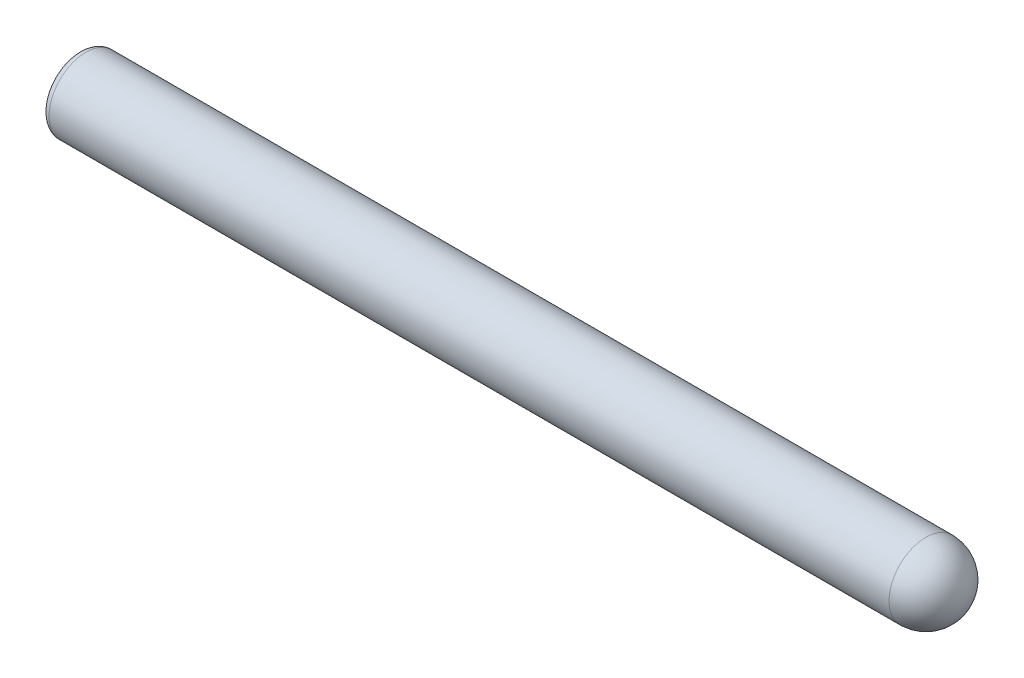
ISO-10303-21;
HEADER;
FILE_DESCRIPTION(('STEP AP214'),'2;1');
FILE_NAME('part.step','',(''),(''),'','','');
FILE_SCHEMA(('AUTOMOTIVE_DESIGN { 1 0 10303 214 1 1 1 1 }'));
ENDSEC;
DATA;
#1=APPLICATION_CONTEXT('core data for automotive mechanical design processes');
#2=APPLICATION_PROTOCOL_DEFINITION('international standard','automotive_design',2000,#1);
#3=PRODUCT_CONTEXT('',#1,'mechanical');
#4=PRODUCT('Part','Part','',(#3));
#5=PRODUCT_RELATED_PRODUCT_CATEGORY('part','',(#4));
#6=PRODUCT_DEFINITION_FORMATION('','',#4);
#7=PRODUCT_DEFINITION_CONTEXT('part definition',#1,'design');
#8=PRODUCT_DEFINITION('design','',#6,#7);
#9=PRODUCT_DEFINITION_SHAPE('','',#8);
#10=(LENGTH_UNIT() NAMED_UNIT(*) SI_UNIT(.MILLI.,.METRE.));
#11=(NAMED_UNIT(*) PLANE_ANGLE_UNIT() SI_UNIT($,.RADIAN.));
#12=(NAMED_UNIT(*) SI_UNIT($,.STERADIAN.) SOLID_ANGLE_UNIT());
#13=UNCERTAINTY_MEASURE_WITH_UNIT(LENGTH_MEASURE(1.E-05),#10,'distance_accuracy_value','');
#14=(GEOMETRIC_REPRESENTATION_CONTEXT(3) GLOBAL_UNCERTAINTY_ASSIGNED_CONTEXT((#13)) GLOBAL_UNIT_ASSIGNED_CONTEXT((#10,
#11,#12)) REPRESENTATION_CONTEXT('',''));
#15=CARTESIAN_POINT('',(0.,0.,0.));
#16=DIRECTION('',(0.,0.,1.));
#17=DIRECTION('',(1.,0.,0.));
#18=AXIS2_PLACEMENT_3D('',#15,#16,#17);
#19=CARTESIAN_POINT('',(12.,0.,0.));
#20=DIRECTION('',(-1.,0.,0.));
#21=DIRECTION('',(0.,0.,1.));
#22=AXIS2_PLACEMENT_3D('',#19,#20,#21);
#23=CYLINDRICAL_SURFACE('',#22,0.5);
#24=CARTESIAN_POINT('',(0.0999999999999994,0.,0.));
#25=DIRECTION('',(1.,0.,0.));
#26=DIRECTION('',(0.,0.,-1.));
#27=AXIS2_PLACEMENT_3D('',#24,#25,#26);
#28=CIRCLE('',#27,0.5);
#29=CARTESIAN_POINT('',(0.0999999999999994,0.,-0.5));
#30=VERTEX_POINT('',#29);
#31=EDGE_CURVE('E41',#30,#30,#28,.T.);
#32=ORIENTED_EDGE('',*,*,#31,.T.);
#33=EDGE_LOOP('',(#32));
#34=FACE_BOUND('',#33,.T.);
#35=CARTESIAN_POINT('',(11.5,0.,0.));
#36=DIRECTION('',(-1.,0.,0.));
#37=DIRECTION('',(0.,0.,1.));
#38=AXIS2_PLACEMENT_3D('',#35,#36,#37);
#39=CIRCLE('',#38,0.5);
#40=CARTESIAN_POINT('',(11.5,0.,0.5));
#41=VERTEX_POINT('',#40);
#42=EDGE_CURVE('E45',#41,#41,#39,.T.);
#43=ORIENTED_EDGE('',*,*,#42,.T.);
#44=EDGE_LOOP('',(#43));
#45=FACE_BOUND('',#44,.T.);
#46=ADVANCED_FACE('F34',(#34,#45),#23,.T.);
#47=CARTESIAN_POINT('',(0.,0.,0.));
#48=DIRECTION('',(1.,0.,0.));
#49=DIRECTION('',(0.,0.,-1.));
#50=AXIS2_PLACEMENT_3D('',#47,#48,#49);
#51=PLANE('',#50);
#52=CARTESIAN_POINT('',(0.,0.,0.));
#53=DIRECTION('',(1.,0.,0.));
#54=DIRECTION('',(0.,0.,-1.));
#55=AXIS2_PLACEMENT_3D('',#52,#53,#54);
#56=CIRCLE('',#55,0.4);
#57=CARTESIAN_POINT('',(0.,0.,-0.4));
#58=VERTEX_POINT('',#57);
#59=EDGE_CURVE('E10',#58,#58,#56,.F.);
#60=ORIENTED_EDGE('',*,*,#59,.T.);
#61=EDGE_LOOP('',(#60));
#62=FACE_BOUND('',#61,.T.);
#63=ADVANCED_FACE('F55',(#62),#51,.F.);
#64=CARTESIAN_POINT('',(11.5,0.,0.));
#65=DIRECTION('',(1.,0.,0.));
#66=DIRECTION('',(0.,0.,-1.));
#67=AXIS2_PLACEMENT_3D('',#64,#65,#66);
#68=SPHERICAL_SURFACE('',#67,0.5);
#69=ORIENTED_EDGE('',*,*,#42,.F.);
#70=EDGE_LOOP('',(#69));
#71=FACE_BOUND('',#70,.T.);
#72=ADVANCED_FACE('F53',(#71),#68,.T.);
#73=CARTESIAN_POINT('',(0.0999999999999994,0.,0.));
#74=DIRECTION('',(1.,0.,0.));
#75=DIRECTION('',(0.,0.,-1.));
#76=AXIS2_PLACEMENT_3D('',#73,#74,#75);
#77=TOROIDAL_SURFACE('',#76,0.4,0.1);
#78=ORIENTED_EDGE('',*,*,#59,.F.);
#79=EDGE_LOOP('',(#78));
#80=FACE_BOUND('',#79,.T.);
#81=ORIENTED_EDGE('',*,*,#31,.F.);
#82=EDGE_LOOP('',(#81));
#83=FACE_BOUND('',#82,.T.);
#84=ADVANCED_FACE('F36',(#80,#83),#77,.T.);
#85=CLOSED_SHELL('',(#46,#63,#72,#84));
#86=MANIFOLD_SOLID_BREP('B2',#85);
#87=ADVANCED_BREP_SHAPE_REPRESENTATION('',(#18,#86),#14);
#88=SHAPE_DEFINITION_REPRESENTATION(#9,#87);
ENDSEC;
END-ISO-10303-21;
